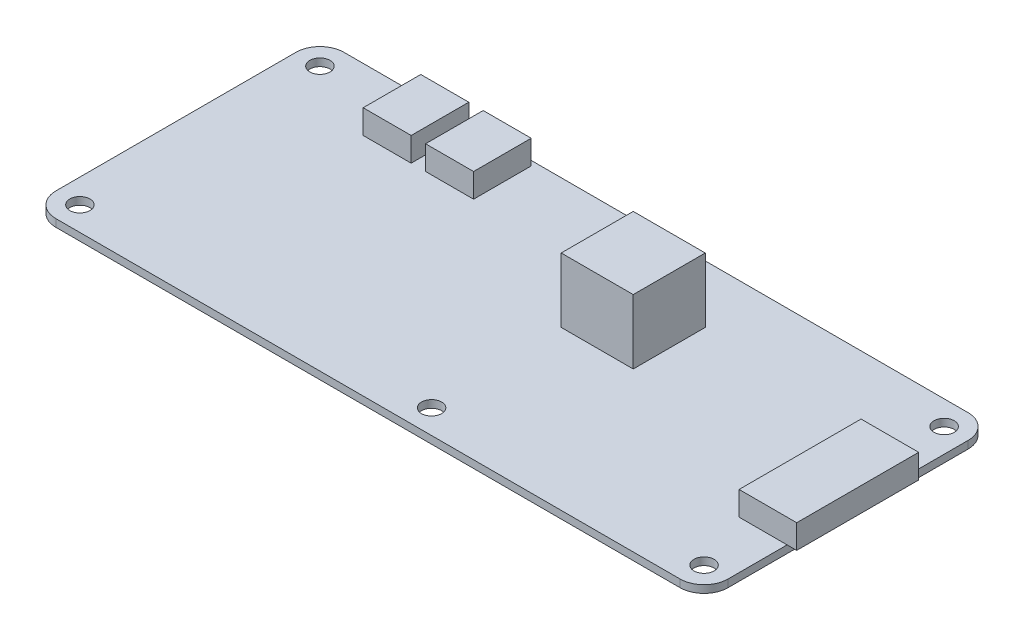
ISO-10303-21;
HEADER;
FILE_DESCRIPTION(('STEP AP214'),'2;1');
FILE_NAME('part.step','',(''),(''),'','','');
FILE_SCHEMA(('AUTOMOTIVE_DESIGN { 1 0 10303 214 1 1 1 1 }'));
ENDSEC;
DATA;
#1=APPLICATION_CONTEXT('core data for automotive mechanical design processes');
#2=APPLICATION_PROTOCOL_DEFINITION('international standard','automotive_design',2000,#1);
#3=PRODUCT_CONTEXT('',#1,'mechanical');
#4=PRODUCT('Part','Part','',(#3));
#5=PRODUCT_RELATED_PRODUCT_CATEGORY('part','',(#4));
#6=PRODUCT_DEFINITION_FORMATION('','',#4);
#7=PRODUCT_DEFINITION_CONTEXT('part definition',#1,'design');
#8=PRODUCT_DEFINITION('design','',#6,#7);
#9=PRODUCT_DEFINITION_SHAPE('','',#8);
#10=(LENGTH_UNIT() NAMED_UNIT(*) SI_UNIT(.MILLI.,.METRE.));
#11=(NAMED_UNIT(*) PLANE_ANGLE_UNIT() SI_UNIT($,.RADIAN.));
#12=(NAMED_UNIT(*) SI_UNIT($,.STERADIAN.) SOLID_ANGLE_UNIT());
#13=UNCERTAINTY_MEASURE_WITH_UNIT(LENGTH_MEASURE(1.E-05),#10,'distance_accuracy_value','');
#14=(GEOMETRIC_REPRESENTATION_CONTEXT(3) GLOBAL_UNCERTAINTY_ASSIGNED_CONTEXT((#13)) GLOBAL_UNIT_ASSIGNED_CONTEXT((#10,
#11,#12)) REPRESENTATION_CONTEXT('',''));
#15=CARTESIAN_POINT('',(0.,0.,0.));
#16=DIRECTION('',(0.,0.,1.));
#17=DIRECTION('',(1.,0.,0.));
#18=AXIS2_PLACEMENT_3D('',#15,#16,#17);
#19=CARTESIAN_POINT('',(5.,1.5748,-5.));
#20=DIRECTION('',(0.,1.,0.));
#21=DIRECTION('',(0.,0.,1.));
#22=AXIS2_PLACEMENT_3D('',#19,#20,#21);
#23=PLANE('',#22);
#24=CARTESIAN_POINT('',(78.2499999640001,1.5748,-55.));
#25=DIRECTION('',(0.,1.,0.));
#26=DIRECTION('',(0.,0.,1.));
#27=AXIS2_PLACEMENT_3D('',#24,#25,#26);
#28=CIRCLE('',#27,2.1);
#29=CARTESIAN_POINT('',(78.2499999640001,1.5748,-52.9));
#30=VERTEX_POINT('',#29);
#31=EDGE_CURVE('E341',#30,#30,#28,.T.);
#32=ORIENTED_EDGE('',*,*,#31,.F.);
#33=EDGE_LOOP('',(#32));
#34=FACE_BOUND('',#33,.T.);
#35=CARTESIAN_POINT('',(135.,1.5748,-5.));
#36=DIRECTION('',(0.,1.,0.));
#37=DIRECTION('',(0.,0.,1.));
#38=AXIS2_PLACEMENT_3D('',#35,#36,#37);
#39=CIRCLE('',#38,2.09999999999999);
#40=CARTESIAN_POINT('',(135.,1.5748,-2.90000000000001));
#41=VERTEX_POINT('',#40);
#42=EDGE_CURVE('E353',#41,#41,#39,.T.);
#43=ORIENTED_EDGE('',*,*,#42,.F.);
#44=EDGE_LOOP('',(#43));
#45=FACE_BOUND('',#44,.T.);
#46=CARTESIAN_POINT('',(5.,1.5748,-55.));
#47=DIRECTION('',(0.,1.,0.));
#48=DIRECTION('',(0.,0.,1.));
#49=AXIS2_PLACEMENT_3D('',#46,#47,#48);
#50=CIRCLE('',#49,2.1);
#51=CARTESIAN_POINT('',(5.,1.5748,-52.9));
#52=VERTEX_POINT('',#51);
#53=EDGE_CURVE('E365',#52,#52,#50,.T.);
#54=ORIENTED_EDGE('',*,*,#53,.F.);
#55=EDGE_LOOP('',(#54));
#56=FACE_BOUND('',#55,.T.);
#57=CARTESIAN_POINT('',(5.,1.5748,-5.));
#58=DIRECTION('',(0.,1.,0.));
#59=DIRECTION('',(0.,0.,1.));
#60=AXIS2_PLACEMENT_3D('',#57,#58,#59);
#61=CIRCLE('',#60,2.1);
#62=CARTESIAN_POINT('',(5.,1.5748,-2.9));
#63=VERTEX_POINT('',#62);
#64=EDGE_CURVE('E359',#63,#63,#61,.T.);
#65=ORIENTED_EDGE('',*,*,#64,.F.);
#66=EDGE_LOOP('',(#65));
#67=FACE_BOUND('',#66,.T.);
#68=CARTESIAN_POINT('',(135.,1.5748,-55.));
#69=DIRECTION('',(0.,1.,0.));
#70=DIRECTION('',(0.,0.,1.));
#71=AXIS2_PLACEMENT_3D('',#68,#69,#70);
#72=CIRCLE('',#71,2.09999999999999);
#73=CARTESIAN_POINT('',(135.,1.5748,-52.9));
#74=VERTEX_POINT('',#73);
#75=EDGE_CURVE('E347',#74,#74,#72,.T.);
#76=ORIENTED_EDGE('',*,*,#75,.F.);
#77=EDGE_LOOP('',(#76));
#78=FACE_BOUND('',#77,.T.);
#79=CARTESIAN_POINT('',(78.249999964,1.5748,-5.));
#80=DIRECTION('',(0.,1.,0.));
#81=DIRECTION('',(0.,0.,1.));
#82=AXIS2_PLACEMENT_3D('',#79,#80,#81);
#83=CIRCLE('',#82,2.1);
#84=CARTESIAN_POINT('',(78.249999964,1.5748,-2.9));
#85=VERTEX_POINT('',#84);
#86=EDGE_CURVE('E335',#85,#85,#83,.T.);
#87=ORIENTED_EDGE('',*,*,#86,.F.);
#88=EDGE_LOOP('',(#87));
#89=FACE_BOUND('',#88,.T.);
#90=DIRECTION('',(0.,0.,1.));
#91=VECTOR('',#90,1.);
#92=CARTESIAN_POINT('',(130.,1.5748,-42.7));
#93=LINE('',#92,#91);
#94=CARTESIAN_POINT('',(130.,1.5748,-42.7));
#95=VERTEX_POINT('',#94);
#96=CARTESIAN_POINT('',(130.,1.5748,-17.3));
#97=VERTEX_POINT('',#96);
#98=EDGE_CURVE('E304',#95,#97,#93,.T.);
#99=ORIENTED_EDGE('',*,*,#98,.F.);
#100=DIRECTION('',(1.,0.,0.));
#101=VECTOR('',#100,1.);
#102=CARTESIAN_POINT('',(130.,1.5748,-42.7));
#103=LINE('',#102,#101);
#104=CARTESIAN_POINT('',(140.,1.5748,-42.7));
#105=VERTEX_POINT('',#104);
#106=EDGE_CURVE('E312',#95,#105,#103,.T.);
#107=ORIENTED_EDGE('',*,*,#106,.T.);
#108=DIRECTION('',(0.,0.,-1.));
#109=VECTOR('',#108,1.);
#110=CARTESIAN_POINT('',(140.,1.5748,-5.00000000000004));
#111=LINE('',#110,#109);
#112=CARTESIAN_POINT('',(140.,1.5748,-55.));
#113=VERTEX_POINT('',#112);
#114=EDGE_CURVE('E379',#105,#113,#111,.T.);
#115=ORIENTED_EDGE('',*,*,#114,.T.);
#116=CARTESIAN_POINT('',(135.,1.5748,-55.));
#117=DIRECTION('',(0.,1.,0.));
#118=DIRECTION('',(0.,0.,1.));
#119=AXIS2_PLACEMENT_3D('',#116,#117,#118);
#120=CIRCLE('',#119,5.);
#121=CARTESIAN_POINT('',(135.,1.5748,-60.));
#122=VERTEX_POINT('',#121);
#123=EDGE_CURVE('E383',#113,#122,#120,.T.);
#124=ORIENTED_EDGE('',*,*,#123,.T.);
#125=DIRECTION('',(-1.,0.,0.));
#126=VECTOR('',#125,1.);
#127=CARTESIAN_POINT('',(5.00000000000004,1.5748,-60.));
#128=LINE('',#127,#126);
#129=CARTESIAN_POINT('',(5.00000000000004,1.5748,-60.));
#130=VERTEX_POINT('',#129);
#131=EDGE_CURVE('E386',#122,#130,#128,.T.);
#132=ORIENTED_EDGE('',*,*,#131,.T.);
#133=CARTESIAN_POINT('',(5.,1.5748,-55.));
#134=DIRECTION('',(0.,1.,0.));
#135=DIRECTION('',(0.,0.,1.));
#136=AXIS2_PLACEMENT_3D('',#133,#134,#135);
#137=CIRCLE('',#136,5.);
#138=CARTESIAN_POINT('',(0.,1.5748,-55.));
#139=VERTEX_POINT('',#138);
#140=EDGE_CURVE('E388',#130,#139,#137,.T.);
#141=ORIENTED_EDGE('',*,*,#140,.T.);
#142=DIRECTION('',(0.,0.,1.));
#143=VECTOR('',#142,1.);
#144=CARTESIAN_POINT('',(0.,1.5748,-5.00000000000004));
#145=LINE('',#144,#143);
#146=CARTESIAN_POINT('',(0.,1.5748,-5.00000000000004));
#147=VERTEX_POINT('',#146);
#148=EDGE_CURVE('E390',#139,#147,#145,.T.);
#149=ORIENTED_EDGE('',*,*,#148,.T.);
#150=CARTESIAN_POINT('',(5.,1.5748,-5.));
#151=DIRECTION('',(0.,1.,0.));
#152=DIRECTION('',(0.,0.,1.));
#153=AXIS2_PLACEMENT_3D('',#150,#151,#152);
#154=CIRCLE('',#153,5.);
#155=CARTESIAN_POINT('',(5.00000000000004,1.5748,0.));
#156=VERTEX_POINT('',#155);
#157=EDGE_CURVE('E371',#147,#156,#154,.T.);
#158=ORIENTED_EDGE('',*,*,#157,.T.);
#159=DIRECTION('',(1.,0.,0.));
#160=VECTOR('',#159,1.);
#161=CARTESIAN_POINT('',(5.00000000000004,1.5748,0.));
#162=LINE('',#161,#160);
#163=CARTESIAN_POINT('',(135.,1.5748,0.));
#164=VERTEX_POINT('',#163);
#165=EDGE_CURVE('E374',#156,#164,#162,.T.);
#166=ORIENTED_EDGE('',*,*,#165,.T.);
#167=CARTESIAN_POINT('',(135.,1.5748,-5.));
#168=DIRECTION('',(0.,1.,0.));
#169=DIRECTION('',(0.,0.,1.));
#170=AXIS2_PLACEMENT_3D('',#167,#168,#169);
#171=CIRCLE('',#170,5.);
#172=CARTESIAN_POINT('',(140.,1.5748,-5.00000000000004));
#173=VERTEX_POINT('',#172);
#174=EDGE_CURVE('E377',#164,#173,#171,.T.);
#175=ORIENTED_EDGE('',*,*,#174,.T.);
#176=CARTESIAN_POINT('',(140.,1.5748,-17.3));
#177=VERTEX_POINT('',#176);
#178=EDGE_CURVE('E380',#173,#177,#111,.T.);
#179=ORIENTED_EDGE('',*,*,#178,.T.);
#180=DIRECTION('',(1.,0.,0.));
#181=VECTOR('',#180,1.);
#182=CARTESIAN_POINT('',(130.,1.5748,-17.3));
#183=LINE('',#182,#181);
#184=EDGE_CURVE('E318',#97,#177,#183,.T.);
#185=ORIENTED_EDGE('',*,*,#184,.F.);
#186=EDGE_LOOP('',(#99,#107,#115,#124,#132,#141,#149,#158,#166,#175,#179,#185));
#187=FACE_BOUND('',#186,.T.);
#188=DIRECTION('',(0.,0.,1.));
#189=VECTOR('',#188,1.);
#190=CARTESIAN_POINT('',(32.,1.5748,-59.));
#191=LINE('',#190,#189);
#192=CARTESIAN_POINT('',(32.,1.5748,-59.));
#193=VERTEX_POINT('',#192);
#194=CARTESIAN_POINT('',(32.,1.5748,-47.));
#195=VERTEX_POINT('',#194);
#196=EDGE_CURVE('E285',#193,#195,#191,.T.);
#197=ORIENTED_EDGE('',*,*,#196,.T.);
#198=DIRECTION('',(1.,0.,0.));
#199=VECTOR('',#198,1.);
#200=CARTESIAN_POINT('',(22.,1.5748,-47.));
#201=LINE('',#200,#199);
#202=CARTESIAN_POINT('',(22.,1.5748,-47.));
#203=VERTEX_POINT('',#202);
#204=EDGE_CURVE('E288',#203,#195,#201,.T.);
#205=ORIENTED_EDGE('',*,*,#204,.F.);
#206=DIRECTION('',(0.,0.,1.));
#207=VECTOR('',#206,1.);
#208=CARTESIAN_POINT('',(22.,1.5748,-59.));
#209=LINE('',#208,#207);
#210=CARTESIAN_POINT('',(22.,1.5748,-59.));
#211=VERTEX_POINT('',#210);
#212=EDGE_CURVE('E279',#211,#203,#209,.T.);
#213=ORIENTED_EDGE('',*,*,#212,.F.);
#214=DIRECTION('',(1.,0.,0.));
#215=VECTOR('',#214,1.);
#216=CARTESIAN_POINT('',(22.,1.5748,-59.));
#217=LINE('',#216,#215);
#218=EDGE_CURVE('E281',#211,#193,#217,.T.);
#219=ORIENTED_EDGE('',*,*,#218,.T.);
#220=EDGE_LOOP('',(#197,#205,#213,#219));
#221=FACE_BOUND('',#220,.T.);
#222=DIRECTION('',(0.,0.,1.));
#223=VECTOR('',#222,1.);
#224=CARTESIAN_POINT('',(45.,1.5748,-59.));
#225=LINE('',#224,#223);
#226=CARTESIAN_POINT('',(45.,1.5748,-59.));
#227=VERTEX_POINT('',#226);
#228=CARTESIAN_POINT('',(45.,1.5748,-47.));
#229=VERTEX_POINT('',#228);
#230=EDGE_CURVE('E254',#227,#229,#225,.T.);
#231=ORIENTED_EDGE('',*,*,#230,.T.);
#232=DIRECTION('',(1.,0.,0.));
#233=VECTOR('',#232,1.);
#234=CARTESIAN_POINT('',(35.,1.5748,-47.));
#235=LINE('',#234,#233);
#236=CARTESIAN_POINT('',(35.,1.5748,-47.));
#237=VERTEX_POINT('',#236);
#238=EDGE_CURVE('E257',#237,#229,#235,.T.);
#239=ORIENTED_EDGE('',*,*,#238,.F.);
#240=DIRECTION('',(0.,0.,1.));
#241=VECTOR('',#240,1.);
#242=CARTESIAN_POINT('',(35.,1.5748,-59.));
#243=LINE('',#242,#241);
#244=CARTESIAN_POINT('',(35.,1.5748,-59.));
#245=VERTEX_POINT('',#244);
#246=EDGE_CURVE('E250',#245,#237,#243,.T.);
#247=ORIENTED_EDGE('',*,*,#246,.F.);
#248=DIRECTION('',(1.,0.,0.));
#249=VECTOR('',#248,1.);
#250=CARTESIAN_POINT('',(35.,1.5748,-59.));
#251=LINE('',#250,#249);
#252=EDGE_CURVE('E63',#245,#227,#251,.T.);
#253=ORIENTED_EDGE('',*,*,#252,.T.);
#254=EDGE_LOOP('',(#231,#239,#247,#253));
#255=FACE_BOUND('',#254,.T.);
#256=DIRECTION('',(1.,0.,0.));
#257=VECTOR('',#256,1.);
#258=CARTESIAN_POINT('',(77.2499999640001,1.5748,-33.));
#259=LINE('',#258,#257);
#260=CARTESIAN_POINT('',(77.2499999640001,1.5748,-33.));
#261=VERTEX_POINT('',#260);
#262=CARTESIAN_POINT('',(92.2499999640001,1.5748,-33.));
#263=VERTEX_POINT('',#262);
#264=EDGE_CURVE('E239',#261,#263,#259,.T.);
#265=ORIENTED_EDGE('',*,*,#264,.F.);
#266=DIRECTION('',(0.,0.,1.));
#267=VECTOR('',#266,1.);
#268=CARTESIAN_POINT('',(77.2499999640001,1.5748,-48.));
#269=LINE('',#268,#267);
#270=CARTESIAN_POINT('',(77.2499999640001,1.5748,-48.));
#271=VERTEX_POINT('',#270);
#272=EDGE_CURVE('E233',#271,#261,#269,.T.);
#273=ORIENTED_EDGE('',*,*,#272,.F.);
#274=DIRECTION('',(-1.,0.,0.));
#275=VECTOR('',#274,1.);
#276=CARTESIAN_POINT('',(77.2499999640001,1.5748,-48.));
#277=LINE('',#276,#275);
#278=CARTESIAN_POINT('',(92.2499999640001,1.5748,-48.));
#279=VERTEX_POINT('',#278);
#280=EDGE_CURVE('E213',#279,#271,#277,.T.);
#281=ORIENTED_EDGE('',*,*,#280,.F.);
#282=DIRECTION('',(0.,0.,-1.));
#283=VECTOR('',#282,1.);
#284=CARTESIAN_POINT('',(92.2499999640001,1.5748,-48.));
#285=LINE('',#284,#283);
#286=EDGE_CURVE('E55',#263,#279,#285,.T.);
#287=ORIENTED_EDGE('',*,*,#286,.F.);
#288=EDGE_LOOP('',(#265,#273,#281,#287));
#289=FACE_BOUND('',#288,.T.);
#290=ADVANCED_FACE('F40',(#34,#45,#56,#67,#78,#89,#187,#221,#255,#289),#23,.T.);
#291=CARTESIAN_POINT('',(5.,0.,-5.));
#292=DIRECTION('',(0.,1.,0.));
#293=DIRECTION('',(0.,0.,1.));
#294=AXIS2_PLACEMENT_3D('',#291,#292,#293);
#295=PLANE('',#294);
#296=CARTESIAN_POINT('',(5.,0.,-5.));
#297=DIRECTION('',(0.,1.,0.));
#298=DIRECTION('',(0.,0.,1.));
#299=AXIS2_PLACEMENT_3D('',#296,#297,#298);
#300=CIRCLE('',#299,5.);
#301=CARTESIAN_POINT('',(0.,0.,-5.00000000000004));
#302=VERTEX_POINT('',#301);
#303=CARTESIAN_POINT('',(5.00000000000004,0.,0.));
#304=VERTEX_POINT('',#303);
#305=EDGE_CURVE('E368',#302,#304,#300,.T.);
#306=ORIENTED_EDGE('',*,*,#305,.F.);
#307=DIRECTION('',(0.,0.,1.));
#308=VECTOR('',#307,1.);
#309=CARTESIAN_POINT('',(0.,0.,-5.00000000000004));
#310=LINE('',#309,#308);
#311=CARTESIAN_POINT('',(0.,0.,-55.));
#312=VERTEX_POINT('',#311);
#313=EDGE_CURVE('E375',#312,#302,#310,.T.);
#314=ORIENTED_EDGE('',*,*,#313,.F.);
#315=CARTESIAN_POINT('',(5.,0.,-55.));
#316=DIRECTION('',(0.,1.,0.));
#317=DIRECTION('',(0.,0.,1.));
#318=AXIS2_PLACEMENT_3D('',#315,#316,#317);
#319=CIRCLE('',#318,5.);
#320=CARTESIAN_POINT('',(5.00000000000004,0.,-60.));
#321=VERTEX_POINT('',#320);
#322=EDGE_CURVE('E405',#321,#312,#319,.T.);
#323=ORIENTED_EDGE('',*,*,#322,.F.);
#324=DIRECTION('',(-1.,0.,0.));
#325=VECTOR('',#324,1.);
#326=CARTESIAN_POINT('',(5.00000000000004,0.,-60.));
#327=LINE('',#326,#325);
#328=CARTESIAN_POINT('',(135.,0.,-60.));
#329=VERTEX_POINT('',#328);
#330=EDGE_CURVE('E403',#329,#321,#327,.T.);
#331=ORIENTED_EDGE('',*,*,#330,.F.);
#332=CARTESIAN_POINT('',(135.,0.,-55.));
#333=DIRECTION('',(0.,1.,0.));
#334=DIRECTION('',(0.,0.,1.));
#335=AXIS2_PLACEMENT_3D('',#332,#333,#334);
#336=CIRCLE('',#335,5.);
#337=CARTESIAN_POINT('',(140.,0.,-55.));
#338=VERTEX_POINT('',#337);
#339=EDGE_CURVE('E401',#338,#329,#336,.T.);
#340=ORIENTED_EDGE('',*,*,#339,.F.);
#341=DIRECTION('',(0.,0.,-1.));
#342=VECTOR('',#341,1.);
#343=CARTESIAN_POINT('',(140.,0.,-5.00000000000004));
#344=LINE('',#343,#342);
#345=CARTESIAN_POINT('',(140.,0.,-5.00000000000004));
#346=VERTEX_POINT('',#345);
#347=EDGE_CURVE('E399',#346,#338,#344,.T.);
#348=ORIENTED_EDGE('',*,*,#347,.F.);
#349=CARTESIAN_POINT('',(135.,0.,-5.));
#350=DIRECTION('',(0.,1.,0.));
#351=DIRECTION('',(0.,0.,1.));
#352=AXIS2_PLACEMENT_3D('',#349,#350,#351);
#353=CIRCLE('',#352,5.);
#354=CARTESIAN_POINT('',(135.,0.,0.));
#355=VERTEX_POINT('',#354);
#356=EDGE_CURVE('E397',#355,#346,#353,.T.);
#357=ORIENTED_EDGE('',*,*,#356,.F.);
#358=DIRECTION('',(1.,0.,0.));
#359=VECTOR('',#358,1.);
#360=CARTESIAN_POINT('',(5.00000000000004,0.,0.));
#361=LINE('',#360,#359);
#362=EDGE_CURVE('E395',#304,#355,#361,.T.);
#363=ORIENTED_EDGE('',*,*,#362,.F.);
#364=EDGE_LOOP('',(#306,#314,#323,#331,#340,#348,#357,#363));
#365=FACE_BOUND('',#364,.T.);
#366=CARTESIAN_POINT('',(5.,0.,-55.));
#367=DIRECTION('',(0.,1.,0.));
#368=DIRECTION('',(0.,0.,1.));
#369=AXIS2_PLACEMENT_3D('',#366,#367,#368);
#370=CIRCLE('',#369,2.1);
#371=CARTESIAN_POINT('',(5.,0.,-52.9));
#372=VERTEX_POINT('',#371);
#373=EDGE_CURVE('E362',#372,#372,#370,.T.);
#374=ORIENTED_EDGE('',*,*,#373,.T.);
#375=EDGE_LOOP('',(#374));
#376=FACE_BOUND('',#375,.T.);
#377=CARTESIAN_POINT('',(5.,0.,-5.));
#378=DIRECTION('',(0.,1.,0.));
#379=DIRECTION('',(0.,0.,1.));
#380=AXIS2_PLACEMENT_3D('',#377,#378,#379);
#381=CIRCLE('',#380,2.1);
#382=CARTESIAN_POINT('',(5.,0.,-2.9));
#383=VERTEX_POINT('',#382);
#384=EDGE_CURVE('E356',#383,#383,#381,.T.);
#385=ORIENTED_EDGE('',*,*,#384,.T.);
#386=EDGE_LOOP('',(#385));
#387=FACE_BOUND('',#386,.T.);
#388=CARTESIAN_POINT('',(135.,0.,-5.));
#389=DIRECTION('',(0.,1.,0.));
#390=DIRECTION('',(0.,0.,1.));
#391=AXIS2_PLACEMENT_3D('',#388,#389,#390);
#392=CIRCLE('',#391,2.09999999999999);
#393=CARTESIAN_POINT('',(135.,0.,-2.90000000000001));
#394=VERTEX_POINT('',#393);
#395=EDGE_CURVE('E350',#394,#394,#392,.T.);
#396=ORIENTED_EDGE('',*,*,#395,.T.);
#397=EDGE_LOOP('',(#396));
#398=FACE_BOUND('',#397,.T.);
#399=CARTESIAN_POINT('',(135.,0.,-55.));
#400=DIRECTION('',(0.,1.,0.));
#401=DIRECTION('',(0.,0.,1.));
#402=AXIS2_PLACEMENT_3D('',#399,#400,#401);
#403=CIRCLE('',#402,2.09999999999999);
#404=CARTESIAN_POINT('',(135.,0.,-52.9));
#405=VERTEX_POINT('',#404);
#406=EDGE_CURVE('E344',#405,#405,#403,.T.);
#407=ORIENTED_EDGE('',*,*,#406,.T.);
#408=EDGE_LOOP('',(#407));
#409=FACE_BOUND('',#408,.T.);
#410=CARTESIAN_POINT('',(78.2499999640001,0.,-55.));
#411=DIRECTION('',(0.,1.,0.));
#412=DIRECTION('',(0.,0.,1.));
#413=AXIS2_PLACEMENT_3D('',#410,#411,#412);
#414=CIRCLE('',#413,2.1);
#415=CARTESIAN_POINT('',(78.2499999640001,0.,-52.9));
#416=VERTEX_POINT('',#415);
#417=EDGE_CURVE('E338',#416,#416,#414,.T.);
#418=ORIENTED_EDGE('',*,*,#417,.T.);
#419=EDGE_LOOP('',(#418));
#420=FACE_BOUND('',#419,.T.);
#421=CARTESIAN_POINT('',(78.249999964,0.,-5.));
#422=DIRECTION('',(0.,1.,0.));
#423=DIRECTION('',(0.,0.,1.));
#424=AXIS2_PLACEMENT_3D('',#421,#422,#423);
#425=CIRCLE('',#424,2.1);
#426=CARTESIAN_POINT('',(78.249999964,0.,-2.9));
#427=VERTEX_POINT('',#426);
#428=EDGE_CURVE('E326',#427,#427,#425,.T.);
#429=ORIENTED_EDGE('',*,*,#428,.T.);
#430=EDGE_LOOP('',(#429));
#431=FACE_BOUND('',#430,.T.);
#432=ADVANCED_FACE('F435',(#365,#376,#387,#398,#409,#420,#431),#295,.F.);
#433=CARTESIAN_POINT('',(5.,1.5748,-5.));
#434=DIRECTION('',(0.,-1.,0.));
#435=DIRECTION('',(0.,0.,-1.));
#436=AXIS2_PLACEMENT_3D('',#433,#434,#435);
#437=CYLINDRICAL_SURFACE('',#436,5.);
#438=ORIENTED_EDGE('',*,*,#305,.T.);
#439=DIRECTION('',(0.,-1.,0.));
#440=VECTOR('',#439,1.);
#441=CARTESIAN_POINT('',(5.00000000000004,1.5748,0.));
#442=LINE('',#441,#440);
#443=EDGE_CURVE('E12',#156,#304,#442,.T.);
#444=ORIENTED_EDGE('',*,*,#443,.F.);
#445=ORIENTED_EDGE('',*,*,#157,.F.);
#446=DIRECTION('',(0.,-1.,0.));
#447=VECTOR('',#446,1.);
#448=CARTESIAN_POINT('',(0.,1.5748,-5.00000000000004));
#449=LINE('',#448,#447);
#450=EDGE_CURVE('E392',#147,#302,#449,.T.);
#451=ORIENTED_EDGE('',*,*,#450,.T.);
#452=EDGE_LOOP('',(#438,#444,#445,#451));
#453=FACE_BOUND('',#452,.T.);
#454=ADVANCED_FACE('F42',(#453),#437,.T.);
#455=CARTESIAN_POINT('',(5.00000000000004,1.5748,0.));
#456=DIRECTION('',(0.,0.,-1.));
#457=DIRECTION('',(-1.,0.,0.));
#458=AXIS2_PLACEMENT_3D('',#455,#456,#457);
#459=PLANE('',#458);
#460=ORIENTED_EDGE('',*,*,#362,.T.);
#461=DIRECTION('',(0.,-1.,0.));
#462=VECTOR('',#461,1.);
#463=CARTESIAN_POINT('',(135.,1.5748,0.));
#464=LINE('',#463,#462);
#465=EDGE_CURVE('E48',#164,#355,#464,.T.);
#466=ORIENTED_EDGE('',*,*,#465,.F.);
#467=ORIENTED_EDGE('',*,*,#165,.F.);
#468=ORIENTED_EDGE('',*,*,#443,.T.);
#469=EDGE_LOOP('',(#460,#466,#467,#468));
#470=FACE_BOUND('',#469,.T.);
#471=ADVANCED_FACE('F517',(#470),#459,.F.);
#472=CARTESIAN_POINT('',(135.,1.5748,-5.));
#473=DIRECTION('',(0.,-1.,0.));
#474=DIRECTION('',(0.,0.,-1.));
#475=AXIS2_PLACEMENT_3D('',#472,#473,#474);
#476=CYLINDRICAL_SURFACE('',#475,5.);
#477=ORIENTED_EDGE('',*,*,#356,.T.);
#478=DIRECTION('',(0.,-1.,0.));
#479=VECTOR('',#478,1.);
#480=CARTESIAN_POINT('',(140.,1.5748,-5.00000000000004));
#481=LINE('',#480,#479);
#482=EDGE_CURVE('E422',#173,#346,#481,.T.);
#483=ORIENTED_EDGE('',*,*,#482,.F.);
#484=ORIENTED_EDGE('',*,*,#174,.F.);
#485=ORIENTED_EDGE('',*,*,#465,.T.);
#486=EDGE_LOOP('',(#477,#483,#484,#485));
#487=FACE_BOUND('',#486,.T.);
#488=ADVANCED_FACE('F429',(#487),#476,.T.);
#489=CARTESIAN_POINT('',(140.,1.5748,-5.00000000000004));
#490=DIRECTION('',(-1.,0.,0.));
#491=DIRECTION('',(0.,0.,1.));
#492=AXIS2_PLACEMENT_3D('',#489,#490,#491);
#493=PLANE('',#492);
#494=ORIENTED_EDGE('',*,*,#347,.T.);
#495=DIRECTION('',(0.,-1.,0.));
#496=VECTOR('',#495,1.);
#497=CARTESIAN_POINT('',(140.,1.5748,-55.));
#498=LINE('',#497,#496);
#499=EDGE_CURVE('E419',#113,#338,#498,.T.);
#500=ORIENTED_EDGE('',*,*,#499,.F.);
#501=ORIENTED_EDGE('',*,*,#114,.F.);
#502=EDGE_CURVE('E384',#177,#105,#111,.T.);
#503=ORIENTED_EDGE('',*,*,#502,.F.);
#504=ORIENTED_EDGE('',*,*,#178,.F.);
#505=ORIENTED_EDGE('',*,*,#482,.T.);
#506=EDGE_LOOP('',(#494,#500,#501,#503,#504,#505));
#507=FACE_BOUND('',#506,.T.);
#508=ADVANCED_FACE('F441',(#507),#493,.F.);
#509=CARTESIAN_POINT('',(135.,1.5748,-55.));
#510=DIRECTION('',(0.,-1.,0.));
#511=DIRECTION('',(0.,0.,-1.));
#512=AXIS2_PLACEMENT_3D('',#509,#510,#511);
#513=CYLINDRICAL_SURFACE('',#512,5.);
#514=ORIENTED_EDGE('',*,*,#339,.T.);
#515=DIRECTION('',(0.,-1.,0.));
#516=VECTOR('',#515,1.);
#517=CARTESIAN_POINT('',(135.,1.5748,-60.));
#518=LINE('',#517,#516);
#519=EDGE_CURVE('E416',#122,#329,#518,.T.);
#520=ORIENTED_EDGE('',*,*,#519,.F.);
#521=ORIENTED_EDGE('',*,*,#123,.F.);
#522=ORIENTED_EDGE('',*,*,#499,.T.);
#523=EDGE_LOOP('',(#514,#520,#521,#522));
#524=FACE_BOUND('',#523,.T.);
#525=ADVANCED_FACE('F446',(#524),#513,.T.);
#526=CARTESIAN_POINT('',(5.00000000000004,1.5748,-60.));
#527=DIRECTION('',(0.,0.,1.));
#528=DIRECTION('',(1.,0.,0.));
#529=AXIS2_PLACEMENT_3D('',#526,#527,#528);
#530=PLANE('',#529);
#531=ORIENTED_EDGE('',*,*,#330,.T.);
#532=DIRECTION('',(0.,-1.,0.));
#533=VECTOR('',#532,1.);
#534=CARTESIAN_POINT('',(5.00000000000004,1.5748,-60.));
#535=LINE('',#534,#533);
#536=EDGE_CURVE('E413',#130,#321,#535,.T.);
#537=ORIENTED_EDGE('',*,*,#536,.F.);
#538=ORIENTED_EDGE('',*,*,#131,.F.);
#539=ORIENTED_EDGE('',*,*,#519,.T.);
#540=EDGE_LOOP('',(#531,#537,#538,#539));
#541=FACE_BOUND('',#540,.T.);
#542=ADVANCED_FACE('F507',(#541),#530,.F.);
#543=CARTESIAN_POINT('',(5.,1.5748,-55.));
#544=DIRECTION('',(0.,-1.,0.));
#545=DIRECTION('',(0.,0.,-1.));
#546=AXIS2_PLACEMENT_3D('',#543,#544,#545);
#547=CYLINDRICAL_SURFACE('',#546,5.);
#548=ORIENTED_EDGE('',*,*,#322,.T.);
#549=DIRECTION('',(0.,-1.,0.));
#550=VECTOR('',#549,1.);
#551=CARTESIAN_POINT('',(0.,1.5748,-55.));
#552=LINE('',#551,#550);
#553=EDGE_CURVE('E410',#139,#312,#552,.T.);
#554=ORIENTED_EDGE('',*,*,#553,.F.);
#555=ORIENTED_EDGE('',*,*,#140,.F.);
#556=ORIENTED_EDGE('',*,*,#536,.T.);
#557=EDGE_LOOP('',(#548,#554,#555,#556));
#558=FACE_BOUND('',#557,.T.);
#559=ADVANCED_FACE('F503',(#558),#547,.T.);
#560=CARTESIAN_POINT('',(0.,1.5748,-5.00000000000004));
#561=DIRECTION('',(1.,0.,0.));
#562=DIRECTION('',(0.,0.,-1.));
#563=AXIS2_PLACEMENT_3D('',#560,#561,#562);
#564=PLANE('',#563);
#565=ORIENTED_EDGE('',*,*,#313,.T.);
#566=ORIENTED_EDGE('',*,*,#450,.F.);
#567=ORIENTED_EDGE('',*,*,#148,.F.);
#568=ORIENTED_EDGE('',*,*,#553,.T.);
#569=EDGE_LOOP('',(#565,#566,#567,#568));
#570=FACE_BOUND('',#569,.T.);
#571=ADVANCED_FACE('F500',(#570),#564,.F.);
#572=CARTESIAN_POINT('',(5.,1.5748,-55.));
#573=DIRECTION('',(0.,-1.,0.));
#574=DIRECTION('',(0.,0.,-1.));
#575=AXIS2_PLACEMENT_3D('',#572,#573,#574);
#576=CYLINDRICAL_SURFACE('',#575,2.1);
#577=ORIENTED_EDGE('',*,*,#53,.T.);
#578=EDGE_LOOP('',(#577));
#579=FACE_BOUND('',#578,.T.);
#580=ORIENTED_EDGE('',*,*,#373,.F.);
#581=EDGE_LOOP('',(#580));
#582=FACE_BOUND('',#581,.T.);
#583=ADVANCED_FACE('F497',(#579,#582),#576,.F.);
#584=CARTESIAN_POINT('',(5.,1.5748,-5.));
#585=DIRECTION('',(0.,-1.,0.));
#586=DIRECTION('',(0.,0.,-1.));
#587=AXIS2_PLACEMENT_3D('',#584,#585,#586);
#588=CYLINDRICAL_SURFACE('',#587,2.1);
#589=ORIENTED_EDGE('',*,*,#64,.T.);
#590=EDGE_LOOP('',(#589));
#591=FACE_BOUND('',#590,.T.);
#592=ORIENTED_EDGE('',*,*,#384,.F.);
#593=EDGE_LOOP('',(#592));
#594=FACE_BOUND('',#593,.T.);
#595=ADVANCED_FACE('F582',(#591,#594),#588,.F.);
#596=CARTESIAN_POINT('',(135.,1.5748,-5.));
#597=DIRECTION('',(0.,-1.,0.));
#598=DIRECTION('',(0.,0.,-1.));
#599=AXIS2_PLACEMENT_3D('',#596,#597,#598);
#600=CYLINDRICAL_SURFACE('',#599,2.09999999999999);
#601=ORIENTED_EDGE('',*,*,#42,.T.);
#602=EDGE_LOOP('',(#601));
#603=FACE_BOUND('',#602,.T.);
#604=ORIENTED_EDGE('',*,*,#395,.F.);
#605=EDGE_LOOP('',(#604));
#606=FACE_BOUND('',#605,.T.);
#607=ADVANCED_FACE('F590',(#603,#606),#600,.F.);
#608=CARTESIAN_POINT('',(135.,1.5748,-55.));
#609=DIRECTION('',(0.,-1.,0.));
#610=DIRECTION('',(0.,0.,-1.));
#611=AXIS2_PLACEMENT_3D('',#608,#609,#610);
#612=CYLINDRICAL_SURFACE('',#611,2.09999999999999);
#613=ORIENTED_EDGE('',*,*,#75,.T.);
#614=EDGE_LOOP('',(#613));
#615=FACE_BOUND('',#614,.T.);
#616=ORIENTED_EDGE('',*,*,#406,.F.);
#617=EDGE_LOOP('',(#616));
#618=FACE_BOUND('',#617,.T.);
#619=ADVANCED_FACE('F598',(#615,#618),#612,.F.);
#620=CARTESIAN_POINT('',(78.2499999640001,1.5748,-55.));
#621=DIRECTION('',(0.,-1.,0.));
#622=DIRECTION('',(0.,0.,-1.));
#623=AXIS2_PLACEMENT_3D('',#620,#621,#622);
#624=CYLINDRICAL_SURFACE('',#623,2.1);
#625=ORIENTED_EDGE('',*,*,#31,.T.);
#626=EDGE_LOOP('',(#625));
#627=FACE_BOUND('',#626,.T.);
#628=ORIENTED_EDGE('',*,*,#417,.F.);
#629=EDGE_LOOP('',(#628));
#630=FACE_BOUND('',#629,.T.);
#631=ADVANCED_FACE('F607',(#627,#630),#624,.F.);
#632=CARTESIAN_POINT('',(78.249999964,1.5748,-5.));
#633=DIRECTION('',(0.,-1.,0.));
#634=DIRECTION('',(0.,0.,-1.));
#635=AXIS2_PLACEMENT_3D('',#632,#633,#634);
#636=CYLINDRICAL_SURFACE('',#635,2.1);
#637=ORIENTED_EDGE('',*,*,#86,.T.);
#638=EDGE_LOOP('',(#637));
#639=FACE_BOUND('',#638,.T.);
#640=ORIENTED_EDGE('',*,*,#428,.F.);
#641=EDGE_LOOP('',(#640));
#642=FACE_BOUND('',#641,.T.);
#643=ADVANCED_FACE('F616',(#639,#642),#636,.F.);
#644=CARTESIAN_POINT('',(130.,6.5748,-42.7));
#645=DIRECTION('',(0.,0.,-1.));
#646=DIRECTION('',(-1.,0.,0.));
#647=AXIS2_PLACEMENT_3D('',#644,#645,#646);
#648=PLANE('',#647);
#649=ORIENTED_EDGE('',*,*,#106,.F.);
#650=DIRECTION('',(0.,-1.,0.));
#651=VECTOR('',#650,1.);
#652=CARTESIAN_POINT('',(130.,6.5748,-42.7));
#653=LINE('',#652,#651);
#654=CARTESIAN_POINT('',(130.,6.5748,-42.7));
#655=VERTEX_POINT('',#654);
#656=EDGE_CURVE('E323',#655,#95,#653,.T.);
#657=ORIENTED_EDGE('',*,*,#656,.F.);
#658=DIRECTION('',(1.,0.,0.));
#659=VECTOR('',#658,1.);
#660=CARTESIAN_POINT('',(130.,6.5748,-42.7));
#661=LINE('',#660,#659);
#662=CARTESIAN_POINT('',(142.,6.5748,-42.7));
#663=VERTEX_POINT('',#662);
#664=EDGE_CURVE('E300',#655,#663,#661,.T.);
#665=ORIENTED_EDGE('',*,*,#664,.T.);
#666=DIRECTION('',(0.,-1.,0.));
#667=VECTOR('',#666,1.);
#668=CARTESIAN_POINT('',(142.,6.5748,-42.7));
#669=LINE('',#668,#667);
#670=CARTESIAN_POINT('',(142.,1.5748,-42.7));
#671=VERTEX_POINT('',#670);
#672=EDGE_CURVE('E311',#663,#671,#669,.T.);
#673=ORIENTED_EDGE('',*,*,#672,.T.);
#674=EDGE_CURVE('E291',#105,#671,#103,.T.);
#675=ORIENTED_EDGE('',*,*,#674,.F.);
#676=EDGE_LOOP('',(#649,#657,#665,#673,#675));
#677=FACE_BOUND('',#676,.T.);
#678=ADVANCED_FACE('F459',(#677),#648,.T.);
#679=CARTESIAN_POINT('',(130.,6.5748,-42.7));
#680=DIRECTION('',(1.,0.,0.));
#681=DIRECTION('',(0.,0.,-1.));
#682=AXIS2_PLACEMENT_3D('',#679,#680,#681);
#683=PLANE('',#682);
#684=ORIENTED_EDGE('',*,*,#98,.T.);
#685=DIRECTION('',(0.,-1.,0.));
#686=VECTOR('',#685,1.);
#687=CARTESIAN_POINT('',(130.,6.5748,-17.3));
#688=LINE('',#687,#686);
#689=CARTESIAN_POINT('',(130.,6.5748,-17.3));
#690=VERTEX_POINT('',#689);
#691=EDGE_CURVE('E327',#690,#97,#688,.T.);
#692=ORIENTED_EDGE('',*,*,#691,.F.);
#693=DIRECTION('',(0.,0.,1.));
#694=VECTOR('',#693,1.);
#695=CARTESIAN_POINT('',(130.,6.5748,-42.7));
#696=LINE('',#695,#694);
#697=EDGE_CURVE('E309',#655,#690,#696,.T.);
#698=ORIENTED_EDGE('',*,*,#697,.F.);
#699=ORIENTED_EDGE('',*,*,#656,.T.);
#700=EDGE_LOOP('',(#684,#692,#698,#699));
#701=FACE_BOUND('',#700,.T.);
#702=ADVANCED_FACE('F471',(#701),#683,.F.);
#703=CARTESIAN_POINT('',(130.,6.5748,-17.3));
#704=DIRECTION('',(0.,0.,-1.));
#705=DIRECTION('',(-1.,0.,0.));
#706=AXIS2_PLACEMENT_3D('',#703,#704,#705);
#707=PLANE('',#706);
#708=ORIENTED_EDGE('',*,*,#184,.T.);
#709=CARTESIAN_POINT('',(142.,1.5748,-17.3));
#710=VERTEX_POINT('',#709);
#711=EDGE_CURVE('E317',#177,#710,#183,.T.);
#712=ORIENTED_EDGE('',*,*,#711,.T.);
#713=DIRECTION('',(0.,-1.,0.));
#714=VECTOR('',#713,1.);
#715=CARTESIAN_POINT('',(142.,6.5748,-17.3));
#716=LINE('',#715,#714);
#717=CARTESIAN_POINT('',(142.,6.5748,-17.3));
#718=VERTEX_POINT('',#717);
#719=EDGE_CURVE('E330',#718,#710,#716,.T.);
#720=ORIENTED_EDGE('',*,*,#719,.F.);
#721=DIRECTION('',(1.,0.,0.));
#722=VECTOR('',#721,1.);
#723=CARTESIAN_POINT('',(130.,6.5748,-17.3));
#724=LINE('',#723,#722);
#725=EDGE_CURVE('E307',#690,#718,#724,.T.);
#726=ORIENTED_EDGE('',*,*,#725,.F.);
#727=ORIENTED_EDGE('',*,*,#691,.T.);
#728=EDGE_LOOP('',(#708,#712,#720,#726,#727));
#729=FACE_BOUND('',#728,.T.);
#730=ADVANCED_FACE('F468',(#729),#707,.F.);
#731=CARTESIAN_POINT('',(142.,6.5748,-42.7));
#732=DIRECTION('',(1.,0.,0.));
#733=DIRECTION('',(0.,0.,-1.));
#734=AXIS2_PLACEMENT_3D('',#731,#732,#733);
#735=PLANE('',#734);
#736=DIRECTION('',(0.,0.,1.));
#737=VECTOR('',#736,1.);
#738=CARTESIAN_POINT('',(142.,1.5748,-42.7));
#739=LINE('',#738,#737);
#740=EDGE_CURVE('E314',#671,#710,#739,.T.);
#741=ORIENTED_EDGE('',*,*,#740,.F.);
#742=ORIENTED_EDGE('',*,*,#672,.F.);
#743=DIRECTION('',(0.,0.,1.));
#744=VECTOR('',#743,1.);
#745=CARTESIAN_POINT('',(142.,6.5748,-42.7));
#746=LINE('',#745,#744);
#747=EDGE_CURVE('E303',#663,#718,#746,.T.);
#748=ORIENTED_EDGE('',*,*,#747,.T.);
#749=ORIENTED_EDGE('',*,*,#719,.T.);
#750=EDGE_LOOP('',(#741,#742,#748,#749));
#751=FACE_BOUND('',#750,.T.);
#752=ADVANCED_FACE('F464',(#751),#735,.T.);
#753=CARTESIAN_POINT('',(0.,6.5748,0.));
#754=DIRECTION('',(0.,-1.,0.));
#755=DIRECTION('',(0.,0.,-1.));
#756=AXIS2_PLACEMENT_3D('',#753,#754,#755);
#757=PLANE('',#756);
#758=ORIENTED_EDGE('',*,*,#664,.F.);
#759=ORIENTED_EDGE('',*,*,#697,.T.);
#760=ORIENTED_EDGE('',*,*,#725,.T.);
#761=ORIENTED_EDGE('',*,*,#747,.F.);
#762=EDGE_LOOP('',(#758,#759,#760,#761));
#763=FACE_BOUND('',#762,.T.);
#764=ADVANCED_FACE('F474',(#763),#757,.F.);
#765=CARTESIAN_POINT('',(0.,1.5748,0.));
#766=DIRECTION('',(0.,-1.,0.));
#767=DIRECTION('',(0.,0.,-1.));
#768=AXIS2_PLACEMENT_3D('',#765,#766,#767);
#769=PLANE('',#768);
#770=ORIENTED_EDGE('',*,*,#711,.F.);
#771=ORIENTED_EDGE('',*,*,#502,.T.);
#772=ORIENTED_EDGE('',*,*,#674,.T.);
#773=ORIENTED_EDGE('',*,*,#740,.T.);
#774=EDGE_LOOP('',(#770,#771,#772,#773));
#775=FACE_BOUND('',#774,.T.);
#776=ADVANCED_FACE('F457',(#775),#769,.T.);
#777=CARTESIAN_POINT('',(22.,6.5748,-47.));
#778=DIRECTION('',(0.,0.,-1.));
#779=DIRECTION('',(-1.,0.,0.));
#780=AXIS2_PLACEMENT_3D('',#777,#778,#779);
#781=PLANE('',#780);
#782=ORIENTED_EDGE('',*,*,#204,.T.);
#783=DIRECTION('',(0.,-1.,0.));
#784=VECTOR('',#783,1.);
#785=CARTESIAN_POINT('',(32.,6.5748,-47.));
#786=LINE('',#785,#784);
#787=CARTESIAN_POINT('',(32.,6.5748,-47.));
#788=VERTEX_POINT('',#787);
#789=EDGE_CURVE('E260',#788,#195,#786,.T.);
#790=ORIENTED_EDGE('',*,*,#789,.F.);
#791=DIRECTION('',(1.,0.,0.));
#792=VECTOR('',#791,1.);
#793=CARTESIAN_POINT('',(22.,6.5748,-47.));
#794=LINE('',#793,#792);
#795=CARTESIAN_POINT('',(22.,6.5748,-47.));
#796=VERTEX_POINT('',#795);
#797=EDGE_CURVE('E282',#796,#788,#794,.T.);
#798=ORIENTED_EDGE('',*,*,#797,.F.);
#799=DIRECTION('',(0.,-1.,0.));
#800=VECTOR('',#799,1.);
#801=CARTESIAN_POINT('',(22.,6.5748,-47.));
#802=LINE('',#801,#800);
#803=EDGE_CURVE('E275',#796,#203,#802,.T.);
#804=ORIENTED_EDGE('',*,*,#803,.T.);
#805=EDGE_LOOP('',(#782,#790,#798,#804));
#806=FACE_BOUND('',#805,.T.);
#807=ADVANCED_FACE('F481',(#806),#781,.F.);
#808=CARTESIAN_POINT('',(32.,6.5748,-59.));
#809=DIRECTION('',(1.,0.,0.));
#810=DIRECTION('',(0.,0.,-1.));
#811=AXIS2_PLACEMENT_3D('',#808,#809,#810);
#812=PLANE('',#811);
#813=ORIENTED_EDGE('',*,*,#196,.F.);
#814=DIRECTION('',(0.,-1.,0.));
#815=VECTOR('',#814,1.);
#816=CARTESIAN_POINT('',(32.,6.5748,-59.));
#817=LINE('',#816,#815);
#818=CARTESIAN_POINT('',(32.,6.5748,-59.));
#819=VERTEX_POINT('',#818);
#820=EDGE_CURVE('E270',#819,#193,#817,.T.);
#821=ORIENTED_EDGE('',*,*,#820,.F.);
#822=DIRECTION('',(0.,0.,1.));
#823=VECTOR('',#822,1.);
#824=CARTESIAN_POINT('',(32.,6.5748,-59.));
#825=LINE('',#824,#823);
#826=EDGE_CURVE('E296',#819,#788,#825,.T.);
#827=ORIENTED_EDGE('',*,*,#826,.T.);
#828=ORIENTED_EDGE('',*,*,#789,.T.);
#829=EDGE_LOOP('',(#813,#821,#827,#828));
#830=FACE_BOUND('',#829,.T.);
#831=ADVANCED_FACE('F668',(#830),#812,.T.);
#832=CARTESIAN_POINT('',(22.,6.5748,-59.));
#833=DIRECTION('',(0.,0.,-1.));
#834=DIRECTION('',(-1.,0.,0.));
#835=AXIS2_PLACEMENT_3D('',#832,#833,#834);
#836=PLANE('',#835);
#837=ORIENTED_EDGE('',*,*,#218,.F.);
#838=DIRECTION('',(0.,-1.,0.));
#839=VECTOR('',#838,1.);
#840=CARTESIAN_POINT('',(22.,6.5748,-59.));
#841=LINE('',#840,#839);
#842=CARTESIAN_POINT('',(22.,6.5748,-59.));
#843=VERTEX_POINT('',#842);
#844=EDGE_CURVE('E272',#843,#211,#841,.T.);
#845=ORIENTED_EDGE('',*,*,#844,.F.);
#846=DIRECTION('',(1.,0.,0.));
#847=VECTOR('',#846,1.);
#848=CARTESIAN_POINT('',(22.,6.5748,-59.));
#849=LINE('',#848,#847);
#850=EDGE_CURVE('E293',#843,#819,#849,.T.);
#851=ORIENTED_EDGE('',*,*,#850,.T.);
#852=ORIENTED_EDGE('',*,*,#820,.T.);
#853=EDGE_LOOP('',(#837,#845,#851,#852));
#854=FACE_BOUND('',#853,.T.);
#855=ADVANCED_FACE('F677',(#854),#836,.T.);
#856=CARTESIAN_POINT('',(22.,6.5748,-59.));
#857=DIRECTION('',(1.,0.,0.));
#858=DIRECTION('',(0.,0.,-1.));
#859=AXIS2_PLACEMENT_3D('',#856,#857,#858);
#860=PLANE('',#859);
#861=ORIENTED_EDGE('',*,*,#212,.T.);
#862=ORIENTED_EDGE('',*,*,#803,.F.);
#863=DIRECTION('',(0.,0.,1.));
#864=VECTOR('',#863,1.);
#865=CARTESIAN_POINT('',(22.,6.5748,-59.));
#866=LINE('',#865,#864);
#867=EDGE_CURVE('E278',#843,#796,#866,.T.);
#868=ORIENTED_EDGE('',*,*,#867,.F.);
#869=ORIENTED_EDGE('',*,*,#844,.T.);
#870=EDGE_LOOP('',(#861,#862,#868,#869));
#871=FACE_BOUND('',#870,.T.);
#872=ADVANCED_FACE('F686',(#871),#860,.F.);
#873=CARTESIAN_POINT('',(0.,6.5748,0.));
#874=DIRECTION('',(0.,-1.,0.));
#875=DIRECTION('',(0.,0.,-1.));
#876=AXIS2_PLACEMENT_3D('',#873,#874,#875);
#877=PLANE('',#876);
#878=ORIENTED_EDGE('',*,*,#797,.T.);
#879=ORIENTED_EDGE('',*,*,#826,.F.);
#880=ORIENTED_EDGE('',*,*,#850,.F.);
#881=ORIENTED_EDGE('',*,*,#867,.T.);
#882=EDGE_LOOP('',(#878,#879,#880,#881));
#883=FACE_BOUND('',#882,.T.);
#884=ADVANCED_FACE('F695',(#883),#877,.F.);
#885=CARTESIAN_POINT('',(35.,6.5748,-47.));
#886=DIRECTION('',(0.,0.,-1.));
#887=DIRECTION('',(-1.,0.,0.));
#888=AXIS2_PLACEMENT_3D('',#885,#886,#887);
#889=PLANE('',#888);
#890=ORIENTED_EDGE('',*,*,#238,.T.);
#891=DIRECTION('',(0.,-1.,0.));
#892=VECTOR('',#891,1.);
#893=CARTESIAN_POINT('',(45.,6.5748,-47.));
#894=LINE('',#893,#892);
#895=CARTESIAN_POINT('',(45.,6.5748,-47.));
#896=VERTEX_POINT('',#895);
#897=EDGE_CURVE('E227',#896,#229,#894,.T.);
#898=ORIENTED_EDGE('',*,*,#897,.F.);
#899=DIRECTION('',(1.,0.,0.));
#900=VECTOR('',#899,1.);
#901=CARTESIAN_POINT('',(35.,6.5748,-47.));
#902=LINE('',#901,#900);
#903=CARTESIAN_POINT('',(35.,6.5748,-47.));
#904=VERTEX_POINT('',#903);
#905=EDGE_CURVE('E252',#904,#896,#902,.T.);
#906=ORIENTED_EDGE('',*,*,#905,.F.);
#907=DIRECTION('',(0.,-1.,0.));
#908=VECTOR('',#907,1.);
#909=CARTESIAN_POINT('',(35.,6.5748,-47.));
#910=LINE('',#909,#908);
#911=EDGE_CURVE('E246',#904,#237,#910,.T.);
#912=ORIENTED_EDGE('',*,*,#911,.T.);
#913=EDGE_LOOP('',(#890,#898,#906,#912));
#914=FACE_BOUND('',#913,.T.);
#915=ADVANCED_FACE('F704',(#914),#889,.F.);
#916=CARTESIAN_POINT('',(45.,6.5748,-59.));
#917=DIRECTION('',(1.,0.,0.));
#918=DIRECTION('',(0.,0.,-1.));
#919=AXIS2_PLACEMENT_3D('',#916,#917,#918);
#920=PLANE('',#919);
#921=ORIENTED_EDGE('',*,*,#230,.F.);
#922=DIRECTION('',(0.,-1.,0.));
#923=VECTOR('',#922,1.);
#924=CARTESIAN_POINT('',(45.,6.5748,-59.));
#925=LINE('',#924,#923);
#926=CARTESIAN_POINT('',(45.,6.5748,-59.));
#927=VERTEX_POINT('',#926);
#928=EDGE_CURVE('E229',#927,#227,#925,.T.);
#929=ORIENTED_EDGE('',*,*,#928,.F.);
#930=DIRECTION('',(0.,0.,1.));
#931=VECTOR('',#930,1.);
#932=CARTESIAN_POINT('',(45.,6.5748,-59.));
#933=LINE('',#932,#931);
#934=EDGE_CURVE('E265',#927,#896,#933,.T.);
#935=ORIENTED_EDGE('',*,*,#934,.T.);
#936=ORIENTED_EDGE('',*,*,#897,.T.);
#937=EDGE_LOOP('',(#921,#929,#935,#936));
#938=FACE_BOUND('',#937,.T.);
#939=ADVANCED_FACE('F712',(#938),#920,.T.);
#940=CARTESIAN_POINT('',(35.,6.5748,-59.));
#941=DIRECTION('',(0.,0.,-1.));
#942=DIRECTION('',(-1.,0.,0.));
#943=AXIS2_PLACEMENT_3D('',#940,#941,#942);
#944=PLANE('',#943);
#945=ORIENTED_EDGE('',*,*,#252,.F.);
#946=DIRECTION('',(0.,-1.,0.));
#947=VECTOR('',#946,1.);
#948=CARTESIAN_POINT('',(35.,6.5748,-59.));
#949=LINE('',#948,#947);
#950=CARTESIAN_POINT('',(35.,6.5748,-59.));
#951=VERTEX_POINT('',#950);
#952=EDGE_CURVE('E244',#951,#245,#949,.T.);
#953=ORIENTED_EDGE('',*,*,#952,.F.);
#954=DIRECTION('',(1.,0.,0.));
#955=VECTOR('',#954,1.);
#956=CARTESIAN_POINT('',(35.,6.5748,-59.));
#957=LINE('',#956,#955);
#958=EDGE_CURVE('E262',#951,#927,#957,.T.);
#959=ORIENTED_EDGE('',*,*,#958,.T.);
#960=ORIENTED_EDGE('',*,*,#928,.T.);
#961=EDGE_LOOP('',(#945,#953,#959,#960));
#962=FACE_BOUND('',#961,.T.);
#963=ADVANCED_FACE('F721',(#962),#944,.T.);
#964=CARTESIAN_POINT('',(35.,6.5748,-59.));
#965=DIRECTION('',(1.,0.,0.));
#966=DIRECTION('',(0.,0.,-1.));
#967=AXIS2_PLACEMENT_3D('',#964,#965,#966);
#968=PLANE('',#967);
#969=ORIENTED_EDGE('',*,*,#246,.T.);
#970=ORIENTED_EDGE('',*,*,#911,.F.);
#971=DIRECTION('',(0.,0.,1.));
#972=VECTOR('',#971,1.);
#973=CARTESIAN_POINT('',(35.,6.5748,-59.));
#974=LINE('',#973,#972);
#975=EDGE_CURVE('E249',#951,#904,#974,.T.);
#976=ORIENTED_EDGE('',*,*,#975,.F.);
#977=ORIENTED_EDGE('',*,*,#952,.T.);
#978=EDGE_LOOP('',(#969,#970,#976,#977));
#979=FACE_BOUND('',#978,.T.);
#980=ADVANCED_FACE('F730',(#979),#968,.F.);
#981=CARTESIAN_POINT('',(0.,6.5748,0.));
#982=DIRECTION('',(0.,-1.,0.));
#983=DIRECTION('',(0.,0.,-1.));
#984=AXIS2_PLACEMENT_3D('',#981,#982,#983);
#985=PLANE('',#984);
#986=ORIENTED_EDGE('',*,*,#905,.T.);
#987=ORIENTED_EDGE('',*,*,#934,.F.);
#988=ORIENTED_EDGE('',*,*,#958,.F.);
#989=ORIENTED_EDGE('',*,*,#975,.T.);
#990=EDGE_LOOP('',(#986,#987,#988,#989));
#991=FACE_BOUND('',#990,.T.);
#992=ADVANCED_FACE('F738',(#991),#985,.F.);
#993=CARTESIAN_POINT('',(77.2499999640001,39.3628034355964,-48.));
#994=DIRECTION('',(1.,0.,0.));
#995=DIRECTION('',(0.,0.,-1.));
#996=AXIS2_PLACEMENT_3D('',#993,#994,#995);
#997=PLANE('',#996);
#998=DIRECTION('',(0.,0.,1.));
#999=VECTOR('',#998,1.);
#1000=CARTESIAN_POINT('',(77.2499999640001,15.,-48.));
#1001=LINE('',#1000,#999);
#1002=CARTESIAN_POINT('',(77.2499999640001,15.,-48.));
#1003=VERTEX_POINT('',#1002);
#1004=CARTESIAN_POINT('',(77.2499999640001,15.,-33.));
#1005=VERTEX_POINT('',#1004);
#1006=EDGE_CURVE('E222',#1003,#1005,#1001,.T.);
#1007=ORIENTED_EDGE('',*,*,#1006,.F.);
#1008=DIRECTION('',(0.,-1.,0.));
#1009=VECTOR('',#1008,1.);
#1010=CARTESIAN_POINT('',(77.2499999640001,39.3628034355964,-48.));
#1011=LINE('',#1010,#1009);
#1012=EDGE_CURVE('E218',#1003,#271,#1011,.T.);
#1013=ORIENTED_EDGE('',*,*,#1012,.T.);
#1014=ORIENTED_EDGE('',*,*,#272,.T.);
#1015=DIRECTION('',(0.,-1.,0.));
#1016=VECTOR('',#1015,1.);
#1017=CARTESIAN_POINT('',(77.2499999640001,39.3628034355964,-33.));
#1018=LINE('',#1017,#1016);
#1019=EDGE_CURVE('E237',#1005,#261,#1018,.T.);
#1020=ORIENTED_EDGE('',*,*,#1019,.F.);
#1021=EDGE_LOOP('',(#1007,#1013,#1014,#1020));
#1022=FACE_BOUND('',#1021,.T.);
#1023=ADVANCED_FACE('F746',(#1022),#997,.F.);
#1024=CARTESIAN_POINT('',(77.2499999640001,39.3628034355964,-33.));
#1025=DIRECTION('',(0.,0.,-1.));
#1026=DIRECTION('',(-1.,0.,0.));
#1027=AXIS2_PLACEMENT_3D('',#1024,#1025,#1026);
#1028=PLANE('',#1027);
#1029=DIRECTION('',(1.,0.,0.));
#1030=VECTOR('',#1029,1.);
#1031=CARTESIAN_POINT('',(77.2499999640001,15.,-33.));
#1032=LINE('',#1031,#1030);
#1033=CARTESIAN_POINT('',(92.2499999640001,15.,-33.));
#1034=VERTEX_POINT('',#1033);
#1035=EDGE_CURVE('E226',#1005,#1034,#1032,.T.);
#1036=ORIENTED_EDGE('',*,*,#1035,.F.);
#1037=ORIENTED_EDGE('',*,*,#1019,.T.);
#1038=ORIENTED_EDGE('',*,*,#264,.T.);
#1039=DIRECTION('',(0.,-1.,0.));
#1040=VECTOR('',#1039,1.);
#1041=CARTESIAN_POINT('',(92.2499999640001,39.3628034355964,-33.));
#1042=LINE('',#1041,#1040);
#1043=EDGE_CURVE('E240',#1034,#263,#1042,.T.);
#1044=ORIENTED_EDGE('',*,*,#1043,.F.);
#1045=EDGE_LOOP('',(#1036,#1037,#1038,#1044));
#1046=FACE_BOUND('',#1045,.T.);
#1047=ADVANCED_FACE('F758',(#1046),#1028,.F.);
#1048=CARTESIAN_POINT('',(92.2499999640001,39.3628034355964,-48.));
#1049=DIRECTION('',(-1.,0.,0.));
#1050=DIRECTION('',(0.,0.,1.));
#1051=AXIS2_PLACEMENT_3D('',#1048,#1049,#1050);
#1052=PLANE('',#1051);
#1053=DIRECTION('',(0.,0.,-1.));
#1054=VECTOR('',#1053,1.);
#1055=CARTESIAN_POINT('',(92.2499999640001,15.,-48.));
#1056=LINE('',#1055,#1054);
#1057=CARTESIAN_POINT('',(92.2499999640001,15.,-48.));
#1058=VERTEX_POINT('',#1057);
#1059=EDGE_CURVE('E208',#1034,#1058,#1056,.T.);
#1060=ORIENTED_EDGE('',*,*,#1059,.F.);
#1061=ORIENTED_EDGE('',*,*,#1043,.T.);
#1062=ORIENTED_EDGE('',*,*,#286,.T.);
#1063=DIRECTION('',(0.,-1.,0.));
#1064=VECTOR('',#1063,1.);
#1065=CARTESIAN_POINT('',(92.2499999640001,39.3628034355964,-48.));
#1066=LINE('',#1065,#1064);
#1067=EDGE_CURVE('E204',#1058,#279,#1066,.T.);
#1068=ORIENTED_EDGE('',*,*,#1067,.F.);
#1069=EDGE_LOOP('',(#1060,#1061,#1062,#1068));
#1070=FACE_BOUND('',#1069,.T.);
#1071=ADVANCED_FACE('F206',(#1070),#1052,.F.);
#1072=CARTESIAN_POINT('',(77.2499999640001,39.3628034355964,-48.));
#1073=DIRECTION('',(0.,0.,1.));
#1074=DIRECTION('',(1.,0.,0.));
#1075=AXIS2_PLACEMENT_3D('',#1072,#1073,#1074);
#1076=PLANE('',#1075);
#1077=DIRECTION('',(-1.,0.,0.));
#1078=VECTOR('',#1077,1.);
#1079=CARTESIAN_POINT('',(77.2499999640001,15.,-48.));
#1080=LINE('',#1079,#1078);
#1081=EDGE_CURVE('E216',#1058,#1003,#1080,.T.);
#1082=ORIENTED_EDGE('',*,*,#1081,.F.);
#1083=ORIENTED_EDGE('',*,*,#1067,.T.);
#1084=ORIENTED_EDGE('',*,*,#280,.T.);
#1085=ORIENTED_EDGE('',*,*,#1012,.F.);
#1086=EDGE_LOOP('',(#1082,#1083,#1084,#1085));
#1087=FACE_BOUND('',#1086,.T.);
#1088=ADVANCED_FACE('F217',(#1087),#1076,.F.);
#1089=CARTESIAN_POINT('',(5.,15.,-5.));
#1090=DIRECTION('',(0.,1.,0.));
#1091=DIRECTION('',(0.,0.,1.));
#1092=AXIS2_PLACEMENT_3D('',#1089,#1090,#1091);
#1093=PLANE('',#1092);
#1094=ORIENTED_EDGE('',*,*,#1081,.T.);
#1095=ORIENTED_EDGE('',*,*,#1006,.T.);
#1096=ORIENTED_EDGE('',*,*,#1035,.T.);
#1097=ORIENTED_EDGE('',*,*,#1059,.T.);
#1098=EDGE_LOOP('',(#1094,#1095,#1096,#1097));
#1099=FACE_BOUND('',#1098,.T.);
#1100=ADVANCED_FACE('F225',(#1099),#1093,.T.);
#1101=CLOSED_SHELL('',(#290,#432,#454,#471,#488,#508,#525,#542,#559,#571,#583,#595,#607,#619,
#631,#643,#678,#702,#730,#752,#764,#776,#807,#831,#855,#872,#884,#915,#939,#963,#980,#992,#1023,
#1047,#1071,#1088,#1100));
#1102=MANIFOLD_SOLID_BREP('B2',#1101);
#1103=ADVANCED_BREP_SHAPE_REPRESENTATION('',(#18,#1102),#14);
#1104=SHAPE_DEFINITION_REPRESENTATION(#9,#1103);
ENDSEC;
END-ISO-10303-21;
